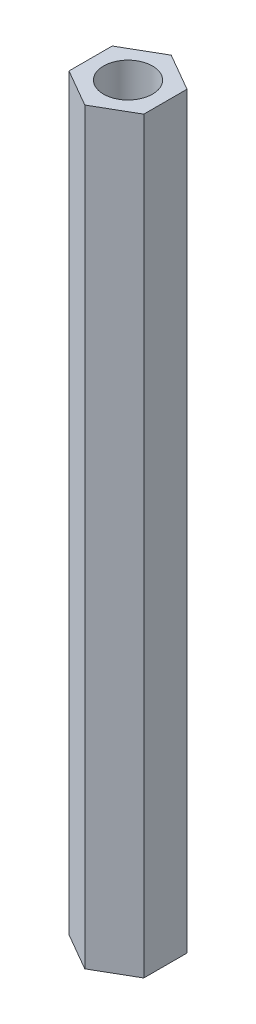
ISO-10303-21;
HEADER;
FILE_DESCRIPTION(('STEP AP214'),'2;1');
FILE_NAME('part.step','',(''),(''),'','','');
FILE_SCHEMA(('AUTOMOTIVE_DESIGN { 1 0 10303 214 1 1 1 1 }'));
ENDSEC;
DATA;
#1=APPLICATION_CONTEXT('core data for automotive mechanical design processes');
#2=APPLICATION_PROTOCOL_DEFINITION('international standard','automotive_design',2000,#1);
#3=PRODUCT_CONTEXT('',#1,'mechanical');
#4=PRODUCT('Part','Part','',(#3));
#5=PRODUCT_RELATED_PRODUCT_CATEGORY('part','',(#4));
#6=PRODUCT_DEFINITION_FORMATION('','',#4);
#7=PRODUCT_DEFINITION_CONTEXT('part definition',#1,'design');
#8=PRODUCT_DEFINITION('design','',#6,#7);
#9=PRODUCT_DEFINITION_SHAPE('','',#8);
#10=(LENGTH_UNIT() NAMED_UNIT(*) SI_UNIT(.MILLI.,.METRE.));
#11=(NAMED_UNIT(*) PLANE_ANGLE_UNIT() SI_UNIT($,.RADIAN.));
#12=(NAMED_UNIT(*) SI_UNIT($,.STERADIAN.) SOLID_ANGLE_UNIT());
#13=UNCERTAINTY_MEASURE_WITH_UNIT(LENGTH_MEASURE(1.E-05),#10,'distance_accuracy_value','');
#14=(GEOMETRIC_REPRESENTATION_CONTEXT(3) GLOBAL_UNCERTAINTY_ASSIGNED_CONTEXT((#13)) GLOBAL_UNIT_ASSIGNED_CONTEXT((#10,
#11,#12)) REPRESENTATION_CONTEXT('',''));
#15=CARTESIAN_POINT('',(0.,0.,0.));
#16=DIRECTION('',(0.,0.,1.));
#17=DIRECTION('',(1.,0.,0.));
#18=AXIS2_PLACEMENT_3D('',#15,#16,#17);
#19=CARTESIAN_POINT('',(0.,50.,0.));
#20=DIRECTION('',(0.,-1.,0.));
#21=DIRECTION('',(0.,0.,-1.));
#22=AXIS2_PLACEMENT_3D('',#19,#20,#21);
#23=PLANE('',#22);
#24=DIRECTION('',(-0.86602542888642,0.,-0.49999995652209));
#25=VECTOR('',#24,1.);
#26=CARTESIAN_POINT('',(-1.44938846189692E-07,50.,-2.887));
#27=LINE('',#26,#25);
#28=CARTESIAN_POINT('',(2.50021526825625,50.,-1.44350012552072));
#29=VERTEX_POINT('',#28);
#30=CARTESIAN_POINT('',(-1.44938846189692E-07,50.,-2.887));
#31=VERTEX_POINT('',#30);
#32=EDGE_CURVE('E130',#29,#31,#27,.T.);
#33=ORIENTED_EDGE('',*,*,#32,.T.);
#34=DIRECTION('',(-0.866025378682455,0.,0.500000043477908));
#35=VECTOR('',#34,1.);
#36=CARTESIAN_POINT('',(-2.50021541319509,50.,-1.44349987447928));
#37=LINE('',#36,#35);
#38=CARTESIAN_POINT('',(-2.50021541319509,50.,-1.44349987447928));
#39=VERTEX_POINT('',#38);
#40=EDGE_CURVE('E88',#31,#39,#37,.T.);
#41=ORIENTED_EDGE('',*,*,#40,.T.);
#42=DIRECTION('',(5.02039646973577E-08,0.,0.999999999999999));
#43=VECTOR('',#42,1.);
#44=CARTESIAN_POINT('',(-2.50021526825625,50.,1.44350012552072));
#45=LINE('',#44,#43);
#46=CARTESIAN_POINT('',(-2.50021526825625,50.,1.44350012552072));
#47=VERTEX_POINT('',#46);
#48=EDGE_CURVE('E101',#39,#47,#45,.T.);
#49=ORIENTED_EDGE('',*,*,#48,.T.);
#50=DIRECTION('',(0.86602542888642,0.,0.49999995652209));
#51=VECTOR('',#50,1.);
#52=CARTESIAN_POINT('',(1.44938846487848E-07,50.,2.887));
#53=LINE('',#52,#51);
#54=CARTESIAN_POINT('',(1.44938846487848E-07,50.,2.887));
#55=VERTEX_POINT('',#54);
#56=EDGE_CURVE('E95',#47,#55,#53,.T.);
#57=ORIENTED_EDGE('',*,*,#56,.T.);
#58=DIRECTION('',(0.866025378682455,0.,-0.500000043477908));
#59=VECTOR('',#58,1.);
#60=CARTESIAN_POINT('',(2.50021541319509,50.,1.44349987447928));
#61=LINE('',#60,#59);
#62=CARTESIAN_POINT('',(2.50021541319509,50.,1.44349987447928));
#63=VERTEX_POINT('',#62);
#64=EDGE_CURVE('E99',#55,#63,#61,.T.);
#65=ORIENTED_EDGE('',*,*,#64,.T.);
#66=DIRECTION('',(-5.02039645471391E-08,0.,-0.999999999999999));
#67=VECTOR('',#66,1.);
#68=CARTESIAN_POINT('',(2.50021526825625,50.,-1.44350012552072));
#69=LINE('',#68,#67);
#70=EDGE_CURVE('E51',#63,#29,#69,.T.);
#71=ORIENTED_EDGE('',*,*,#70,.T.);
#72=EDGE_LOOP('',(#33,#41,#49,#57,#65,#71));
#73=FACE_BOUND('',#72,.T.);
#74=CARTESIAN_POINT('',(0.,50.,0.));
#75=DIRECTION('',(0.,1.,0.));
#76=DIRECTION('',(0.,0.,1.));
#77=AXIS2_PLACEMENT_3D('',#74,#75,#76);
#78=CIRCLE('',#77,1.635);
#79=CARTESIAN_POINT('',(0.,50.,1.635));
#80=VERTEX_POINT('',#79);
#81=EDGE_CURVE('E123',#80,#80,#78,.T.);
#82=ORIENTED_EDGE('',*,*,#81,.F.);
#83=EDGE_LOOP('',(#82));
#84=FACE_BOUND('',#83,.T.);
#85=ADVANCED_FACE('F34',(#73,#84),#23,.F.);
#86=CARTESIAN_POINT('',(0.,0.,0.));
#87=DIRECTION('',(0.,-1.,0.));
#88=DIRECTION('',(0.,0.,-1.));
#89=AXIS2_PLACEMENT_3D('',#86,#87,#88);
#90=PLANE('',#89);
#91=DIRECTION('',(-0.86602542888642,0.,-0.49999995652209));
#92=VECTOR('',#91,1.);
#93=CARTESIAN_POINT('',(-1.44938846189692E-07,0.,-2.887));
#94=LINE('',#93,#92);
#95=CARTESIAN_POINT('',(2.50021526825625,0.,-1.44350012552072));
#96=VERTEX_POINT('',#95);
#97=CARTESIAN_POINT('',(-1.44938846189692E-07,0.,-2.887));
#98=VERTEX_POINT('',#97);
#99=EDGE_CURVE('E119',#96,#98,#94,.T.);
#100=ORIENTED_EDGE('',*,*,#99,.F.);
#101=DIRECTION('',(-5.02039645471391E-08,0.,-0.999999999999999));
#102=VECTOR('',#101,1.);
#103=CARTESIAN_POINT('',(2.50021526825625,0.,-1.44350012552072));
#104=LINE('',#103,#102);
#105=CARTESIAN_POINT('',(2.50021541319509,0.,1.44349987447928));
#106=VERTEX_POINT('',#105);
#107=EDGE_CURVE('E80',#106,#96,#104,.T.);
#108=ORIENTED_EDGE('',*,*,#107,.F.);
#109=DIRECTION('',(0.866025378682455,0.,-0.500000043477908));
#110=VECTOR('',#109,1.);
#111=CARTESIAN_POINT('',(2.50021541319509,0.,1.44349987447928));
#112=LINE('',#111,#110);
#113=CARTESIAN_POINT('',(1.44938846487848E-07,0.,2.887));
#114=VERTEX_POINT('',#113);
#115=EDGE_CURVE('E74',#114,#106,#112,.T.);
#116=ORIENTED_EDGE('',*,*,#115,.F.);
#117=DIRECTION('',(0.86602542888642,0.,0.49999995652209));
#118=VECTOR('',#117,1.);
#119=CARTESIAN_POINT('',(1.44938846487848E-07,0.,2.887));
#120=LINE('',#119,#118);
#121=CARTESIAN_POINT('',(-2.50021526825625,0.,1.44350012552072));
#122=VERTEX_POINT('',#121);
#123=EDGE_CURVE('E109',#122,#114,#120,.T.);
#124=ORIENTED_EDGE('',*,*,#123,.F.);
#125=DIRECTION('',(5.02039646973577E-08,0.,0.999999999999999));
#126=VECTOR('',#125,1.);
#127=CARTESIAN_POINT('',(-2.50021526825625,0.,1.44350012552072));
#128=LINE('',#127,#126);
#129=CARTESIAN_POINT('',(-2.50021541319509,0.,-1.44349987447928));
#130=VERTEX_POINT('',#129);
#131=EDGE_CURVE('E125',#130,#122,#128,.T.);
#132=ORIENTED_EDGE('',*,*,#131,.F.);
#133=DIRECTION('',(-0.866025378682455,0.,0.500000043477908));
#134=VECTOR('',#133,1.);
#135=CARTESIAN_POINT('',(-2.50021541319509,0.,-1.44349987447928));
#136=LINE('',#135,#134);
#137=EDGE_CURVE('E122',#98,#130,#136,.T.);
#138=ORIENTED_EDGE('',*,*,#137,.F.);
#139=EDGE_LOOP('',(#100,#108,#116,#124,#132,#138));
#140=FACE_BOUND('',#139,.T.);
#141=CARTESIAN_POINT('',(0.,0.,0.));
#142=DIRECTION('',(0.,1.,0.));
#143=DIRECTION('',(0.,0.,1.));
#144=AXIS2_PLACEMENT_3D('',#141,#142,#143);
#145=CIRCLE('',#144,1.635);
#146=CARTESIAN_POINT('',(0.,0.,1.635));
#147=VERTEX_POINT('',#146);
#148=EDGE_CURVE('E223',#147,#147,#145,.T.);
#149=ORIENTED_EDGE('',*,*,#148,.T.);
#150=EDGE_LOOP('',(#149));
#151=FACE_BOUND('',#150,.T.);
#152=ADVANCED_FACE('F139',(#140,#151),#90,.T.);
#153=CARTESIAN_POINT('',(-1.44938846189692E-07,50.,-2.887));
#154=DIRECTION('',(-0.499999956522091,0.,0.86602542888642));
#155=DIRECTION('',(0.86602542888642,0.,0.499999956522091));
#156=AXIS2_PLACEMENT_3D('',#153,#154,#155);
#157=PLANE('',#156);
#158=ORIENTED_EDGE('',*,*,#99,.T.);
#159=DIRECTION('',(0.,-1.,0.));
#160=VECTOR('',#159,1.);
#161=CARTESIAN_POINT('',(-1.44938846189692E-07,50.,-2.887));
#162=LINE('',#161,#160);
#163=EDGE_CURVE('E11',#31,#98,#162,.T.);
#164=ORIENTED_EDGE('',*,*,#163,.F.);
#165=ORIENTED_EDGE('',*,*,#32,.F.);
#166=DIRECTION('',(0.,-1.,0.));
#167=VECTOR('',#166,1.);
#168=CARTESIAN_POINT('',(2.50021526825625,50.,-1.44350012552072));
#169=LINE('',#168,#167);
#170=EDGE_CURVE('E115',#29,#96,#169,.T.);
#171=ORIENTED_EDGE('',*,*,#170,.T.);
#172=EDGE_LOOP('',(#158,#164,#165,#171));
#173=FACE_BOUND('',#172,.T.);
#174=ADVANCED_FACE('F36',(#173),#157,.F.);
#175=CARTESIAN_POINT('',(-2.50021541319509,50.,-1.44349987447928));
#176=DIRECTION('',(0.500000043477908,0.,0.866025378682455));
#177=DIRECTION('',(0.866025378682455,0.,-0.500000043477908));
#178=AXIS2_PLACEMENT_3D('',#175,#176,#177);
#179=PLANE('',#178);
#180=ORIENTED_EDGE('',*,*,#137,.T.);
#181=DIRECTION('',(0.,-1.,0.));
#182=VECTOR('',#181,1.);
#183=CARTESIAN_POINT('',(-2.50021541319509,50.,-1.44349987447928));
#184=LINE('',#183,#182);
#185=EDGE_CURVE('E43',#39,#130,#184,.T.);
#186=ORIENTED_EDGE('',*,*,#185,.F.);
#187=ORIENTED_EDGE('',*,*,#40,.F.);
#188=ORIENTED_EDGE('',*,*,#163,.T.);
#189=EDGE_LOOP('',(#180,#186,#187,#188));
#190=FACE_BOUND('',#189,.T.);
#191=ADVANCED_FACE('F164',(#190),#179,.F.);
#192=CARTESIAN_POINT('',(-2.50021526825625,50.,1.44350012552072));
#193=DIRECTION('',(0.999999999999999,0.,-5.02039646973577E-08));
#194=DIRECTION('',(-5.02039646973577E-08,0.,-0.999999999999999));
#195=AXIS2_PLACEMENT_3D('',#192,#193,#194);
#196=PLANE('',#195);
#197=ORIENTED_EDGE('',*,*,#131,.T.);
#198=DIRECTION('',(0.,-1.,0.));
#199=VECTOR('',#198,1.);
#200=CARTESIAN_POINT('',(-2.50021526825625,50.,1.44350012552072));
#201=LINE('',#200,#199);
#202=EDGE_CURVE('E110',#47,#122,#201,.T.);
#203=ORIENTED_EDGE('',*,*,#202,.F.);
#204=ORIENTED_EDGE('',*,*,#48,.F.);
#205=ORIENTED_EDGE('',*,*,#185,.T.);
#206=EDGE_LOOP('',(#197,#203,#204,#205));
#207=FACE_BOUND('',#206,.T.);
#208=ADVANCED_FACE('F136',(#207),#196,.F.);
#209=CARTESIAN_POINT('',(1.44938846487848E-07,50.,2.887));
#210=DIRECTION('',(0.499999956522091,0.,-0.86602542888642));
#211=DIRECTION('',(-0.86602542888642,0.,-0.499999956522091));
#212=AXIS2_PLACEMENT_3D('',#209,#210,#211);
#213=PLANE('',#212);
#214=ORIENTED_EDGE('',*,*,#123,.T.);
#215=DIRECTION('',(0.,-1.,0.));
#216=VECTOR('',#215,1.);
#217=CARTESIAN_POINT('',(1.44938846487848E-07,50.,2.887));
#218=LINE('',#217,#216);
#219=EDGE_CURVE('E106',#55,#114,#218,.T.);
#220=ORIENTED_EDGE('',*,*,#219,.F.);
#221=ORIENTED_EDGE('',*,*,#56,.F.);
#222=ORIENTED_EDGE('',*,*,#202,.T.);
#223=EDGE_LOOP('',(#214,#220,#221,#222));
#224=FACE_BOUND('',#223,.T.);
#225=ADVANCED_FACE('F107',(#224),#213,.F.);
#226=CARTESIAN_POINT('',(2.50021541319509,50.,1.44349987447928));
#227=DIRECTION('',(-0.500000043477908,0.,-0.866025378682455));
#228=DIRECTION('',(-0.866025378682455,0.,0.500000043477908));
#229=AXIS2_PLACEMENT_3D('',#226,#227,#228);
#230=PLANE('',#229);
#231=ORIENTED_EDGE('',*,*,#115,.T.);
#232=DIRECTION('',(0.,-1.,0.));
#233=VECTOR('',#232,1.);
#234=CARTESIAN_POINT('',(2.50021541319509,50.,1.44349987447928));
#235=LINE('',#234,#233);
#236=EDGE_CURVE('E111',#63,#106,#235,.T.);
#237=ORIENTED_EDGE('',*,*,#236,.F.);
#238=ORIENTED_EDGE('',*,*,#64,.F.);
#239=ORIENTED_EDGE('',*,*,#219,.T.);
#240=EDGE_LOOP('',(#231,#237,#238,#239));
#241=FACE_BOUND('',#240,.T.);
#242=ADVANCED_FACE('F113',(#241),#230,.F.);
#243=CARTESIAN_POINT('',(2.50021526825625,50.,-1.44350012552072));
#244=DIRECTION('',(-0.999999999999999,0.,5.02039645471391E-08));
#245=DIRECTION('',(5.02039645471391E-08,0.,0.999999999999999));
#246=AXIS2_PLACEMENT_3D('',#243,#244,#245);
#247=PLANE('',#246);
#248=ORIENTED_EDGE('',*,*,#107,.T.);
#249=ORIENTED_EDGE('',*,*,#170,.F.);
#250=ORIENTED_EDGE('',*,*,#70,.F.);
#251=ORIENTED_EDGE('',*,*,#236,.T.);
#252=EDGE_LOOP('',(#248,#249,#250,#251));
#253=FACE_BOUND('',#252,.T.);
#254=ADVANCED_FACE('F144',(#253),#247,.F.);
#255=CARTESIAN_POINT('',(0.,50.,0.));
#256=DIRECTION('',(0.,-1.,0.));
#257=DIRECTION('',(0.,0.,-1.));
#258=AXIS2_PLACEMENT_3D('',#255,#256,#257);
#259=CYLINDRICAL_SURFACE('',#258,1.635);
#260=ORIENTED_EDGE('',*,*,#81,.T.);
#261=EDGE_LOOP('',(#260));
#262=FACE_BOUND('',#261,.T.);
#263=ORIENTED_EDGE('',*,*,#148,.F.);
#264=EDGE_LOOP('',(#263));
#265=FACE_BOUND('',#264,.T.);
#266=ADVANCED_FACE('F146',(#262,#265),#259,.F.);
#267=CLOSED_SHELL('',(#85,#152,#174,#191,#208,#225,#242,#254,#266));
#268=MANIFOLD_SOLID_BREP('B2',#267);
#269=ADVANCED_BREP_SHAPE_REPRESENTATION('',(#18,#268),#14);
#270=SHAPE_DEFINITION_REPRESENTATION(#9,#269);
ENDSEC;
END-ISO-10303-21;
